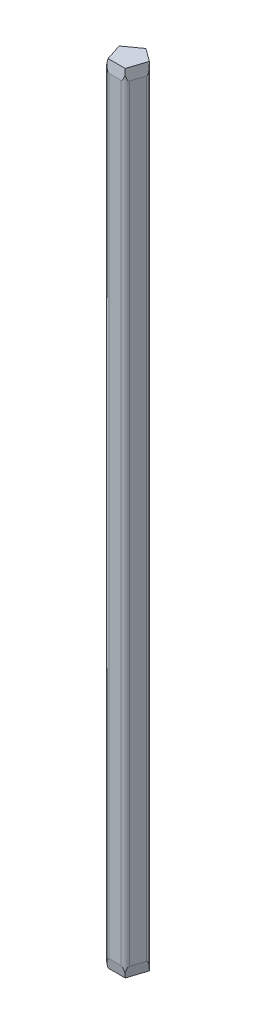
ISO-10303-21;
HEADER;
FILE_DESCRIPTION(('STEP AP214'),'2;1');
FILE_NAME('part.step','',(''),(''),'','','');
FILE_SCHEMA(('AUTOMOTIVE_DESIGN { 1 0 10303 214 1 1 1 1 }'));
ENDSEC;
DATA;
#1=APPLICATION_CONTEXT('core data for automotive mechanical design processes');
#2=APPLICATION_PROTOCOL_DEFINITION('international standard','automotive_design',2000,#1);
#3=PRODUCT_CONTEXT('',#1,'mechanical');
#4=PRODUCT('Part','Part','',(#3));
#5=PRODUCT_RELATED_PRODUCT_CATEGORY('part','',(#4));
#6=PRODUCT_DEFINITION_FORMATION('','',#4);
#7=PRODUCT_DEFINITION_CONTEXT('part definition',#1,'design');
#8=PRODUCT_DEFINITION('design','',#6,#7);
#9=PRODUCT_DEFINITION_SHAPE('','',#8);
#10=(LENGTH_UNIT() NAMED_UNIT(*) SI_UNIT(.MILLI.,.METRE.));
#11=(NAMED_UNIT(*) PLANE_ANGLE_UNIT() SI_UNIT($,.RADIAN.));
#12=(NAMED_UNIT(*) SI_UNIT($,.STERADIAN.) SOLID_ANGLE_UNIT());
#13=UNCERTAINTY_MEASURE_WITH_UNIT(LENGTH_MEASURE(1.E-05),#10,'distance_accuracy_value','');
#14=(GEOMETRIC_REPRESENTATION_CONTEXT(3) GLOBAL_UNCERTAINTY_ASSIGNED_CONTEXT((#13)) GLOBAL_UNIT_ASSIGNED_CONTEXT((#10,
#11,#12)) REPRESENTATION_CONTEXT('',''));
#15=CARTESIAN_POINT('',(0.,0.,0.));
#16=DIRECTION('',(0.,0.,1.));
#17=DIRECTION('',(1.,0.,0.));
#18=AXIS2_PLACEMENT_3D('',#15,#16,#17);
#19=CARTESIAN_POINT('',(6.12830373239022,300.,-1.99120658715122));
#20=DIRECTION('',(-0.587785252292472,0.,0.809016994374948));
#21=DIRECTION('',(0.809016994374948,0.,0.587785252292472));
#22=AXIS2_PLACEMENT_3D('',#19,#20,#21);
#23=PLANE('',#22);
#24=DIRECTION('',(-0.809016994374948,0.,-0.587785252292472));
#25=VECTOR('',#24,1.);
#26=CARTESIAN_POINT('',(6.12830373239022,300.,-1.99120658715122));
#27=LINE('',#26,#25);
#28=CARTESIAN_POINT('',(5.36418290441001,300.,-2.54637286521352));
#29=VERTEX_POINT('',#28);
#30=CARTESIAN_POINT('',(0.764120827980208,300.,-5.88851359520441));
#31=VERTEX_POINT('',#30);
#32=EDGE_CURVE('E396',#29,#31,#27,.T.);
#33=ORIENTED_EDGE('',*,*,#32,.F.);
#34=DIRECTION('',(0.,-1.,0.));
#35=VECTOR('',#34,1.);
#36=CARTESIAN_POINT('',(5.36418290441001,300.,-2.54637286521352));
#37=LINE('',#36,#35);
#38=CARTESIAN_POINT('',(5.36418290441001,0.,-2.54637286521352));
#39=VERTEX_POINT('',#38);
#40=EDGE_CURVE('E311',#29,#39,#37,.T.);
#41=ORIENTED_EDGE('',*,*,#40,.T.);
#42=DIRECTION('',(-0.809016994374948,0.,-0.587785252292472));
#43=VECTOR('',#42,1.);
#44=CARTESIAN_POINT('',(6.12830373239022,0.,-1.99120658715122));
#45=LINE('',#44,#43);
#46=CARTESIAN_POINT('',(0.764120827980208,0.,-5.88851359520441));
#47=VERTEX_POINT('',#46);
#48=EDGE_CURVE('E187',#39,#47,#45,.T.);
#49=ORIENTED_EDGE('',*,*,#48,.T.);
#50=DIRECTION('',(0.,-1.,0.));
#51=VECTOR('',#50,1.);
#52=CARTESIAN_POINT('',(0.76412082798021,300.,-5.88851359520441));
#53=LINE('',#52,#51);
#54=EDGE_CURVE('E308',#47,#31,#53,.F.);
#55=ORIENTED_EDGE('',*,*,#54,.T.);
#56=EDGE_LOOP('',(#33,#41,#49,#55));
#57=FACE_BOUND('',#56,.T.);
#58=ADVANCED_FACE('F49',(#57),#23,.F.);
#59=CARTESIAN_POINT('',(0.,300.,-6.4436798732667));
#60=DIRECTION('',(0.587785252292474,0.,0.809016994374947));
#61=DIRECTION('',(0.809016994374947,0.,-0.587785252292474));
#62=AXIS2_PLACEMENT_3D('',#59,#60,#61);
#63=PLANE('',#62);
#64=DIRECTION('',(0.809016994374947,0.,-0.587785252292474));
#65=VECTOR('',#64,1.);
#66=CARTESIAN_POINT('',(0.,296.,-6.4436798732667));
#67=LINE('',#66,#65);
#68=CARTESIAN_POINT('',(-5.01151175303453,296.,-2.80260345508841));
#69=VERTEX_POINT('',#68);
#70=CARTESIAN_POINT('',(-0.764120827980221,296.,-5.88851359520441));
#71=VERTEX_POINT('',#70);
#72=EDGE_CURVE('E231',#69,#71,#67,.T.);
#73=ORIENTED_EDGE('',*,*,#72,.T.);
#74=DIRECTION('',(0.,-1.,0.));
#75=VECTOR('',#74,1.);
#76=CARTESIAN_POINT('',(-0.764120827980221,300.,-5.88851359520441));
#77=LINE('',#76,#75);
#78=CARTESIAN_POINT('',(-0.764120827980221,4.00000000000011,-5.88851359520441));
#79=VERTEX_POINT('',#78);
#80=EDGE_CURVE('E336',#71,#79,#77,.T.);
#81=ORIENTED_EDGE('',*,*,#80,.T.);
#82=DIRECTION('',(-0.809016994374947,0.,0.587785252292474));
#83=VECTOR('',#82,1.);
#84=CARTESIAN_POINT('',(0.,4.00000000000011,-6.4436798732667));
#85=LINE('',#84,#83);
#86=CARTESIAN_POINT('',(-5.01151175303453,4.00000000000011,-2.80260345508841));
#87=VERTEX_POINT('',#86);
#88=EDGE_CURVE('E235',#79,#87,#85,.T.);
#89=ORIENTED_EDGE('',*,*,#88,.T.);
#90=DIRECTION('',(0.,-1.,0.));
#91=VECTOR('',#90,1.);
#92=CARTESIAN_POINT('',(-5.01151175303453,300.,-2.80260345508841));
#93=LINE('',#92,#91);
#94=EDGE_CURVE('E298',#87,#69,#93,.F.);
#95=ORIENTED_EDGE('',*,*,#94,.T.);
#96=EDGE_LOOP('',(#73,#81,#89,#95));
#97=FACE_BOUND('',#96,.T.);
#98=ADVANCED_FACE('F422',(#97),#63,.F.);
#99=CARTESIAN_POINT('',(-6.12830373239023,300.,-1.99120658715121));
#100=DIRECTION('',(0.951056516295153,0.,-0.309016994374948));
#101=DIRECTION('',(-0.309016994374948,0.,-0.951056516295153));
#102=AXIS2_PLACEMENT_3D('',#99,#100,#101);
#103=PLANE('',#102);
#104=DIRECTION('',(0.309016994374948,0.,0.951056516295153));
#105=VECTOR('',#104,1.);
#106=CARTESIAN_POINT('',(-6.12830373239023,4.00000000000011,-1.99120658715121));
#107=LINE('',#106,#105);
#108=CARTESIAN_POINT('',(-5.70172715463962,4.00000000000011,-0.678338876463612));
#109=VERTEX_POINT('',#108);
#110=CARTESIAN_POINT('',(-4.28143077423754,4.00000000000011,3.69288391140946));
#111=VERTEX_POINT('',#110);
#112=EDGE_CURVE('E228',#109,#111,#107,.T.);
#113=ORIENTED_EDGE('',*,*,#112,.T.);
#114=DIRECTION('',(0.,-1.,0.));
#115=VECTOR('',#114,1.);
#116=CARTESIAN_POINT('',(-4.28143077423754,300.,3.69288391140946));
#117=LINE('',#116,#115);
#118=CARTESIAN_POINT('',(-4.28143077423754,296.,3.69288391140946));
#119=VERTEX_POINT('',#118);
#120=EDGE_CURVE('E72',#111,#119,#117,.F.);
#121=ORIENTED_EDGE('',*,*,#120,.T.);
#122=DIRECTION('',(-0.309016994374948,0.,-0.951056516295153));
#123=VECTOR('',#122,1.);
#124=CARTESIAN_POINT('',(-6.12830373239023,296.,-1.99120658715121));
#125=LINE('',#124,#123);
#126=CARTESIAN_POINT('',(-5.70172715463962,296.,-0.678338876463612));
#127=VERTEX_POINT('',#126);
#128=EDGE_CURVE('E225',#119,#127,#125,.T.);
#129=ORIENTED_EDGE('',*,*,#128,.T.);
#130=DIRECTION('',(0.,-1.,0.));
#131=VECTOR('',#130,1.);
#132=CARTESIAN_POINT('',(-5.70172715463962,300.,-0.678338876463612));
#133=LINE('',#132,#131);
#134=EDGE_CURVE('E289',#127,#109,#133,.T.);
#135=ORIENTED_EDGE('',*,*,#134,.T.);
#136=EDGE_LOOP('',(#113,#121,#129,#135));
#137=FACE_BOUND('',#136,.T.);
#138=ADVANCED_FACE('F359',(#137),#103,.F.);
#139=CARTESIAN_POINT('',(-3.7875,300.,5.21304652378457));
#140=DIRECTION('',(0.,0.,-1.));
#141=DIRECTION('',(-1.,0.,0.));
#142=AXIS2_PLACEMENT_3D('',#139,#140,#141);
#143=PLANE('',#142);
#144=DIRECTION('',(-1.,0.,0.));
#145=VECTOR('',#144,1.);
#146=CARTESIAN_POINT('',(-3.7875,296.,5.21304652378457));
#147=LINE('',#146,#145);
#148=CARTESIAN_POINT('',(2.40706919678982,296.,5.21304652378457));
#149=VERTEX_POINT('',#148);
#150=CARTESIAN_POINT('',(-2.1891064383882,296.,5.21304652378457));
#151=VERTEX_POINT('',#150);
#152=EDGE_CURVE('E218',#149,#151,#147,.T.);
#153=ORIENTED_EDGE('',*,*,#152,.T.);
#154=DIRECTION('',(0.,-1.,0.));
#155=VECTOR('',#154,1.);
#156=CARTESIAN_POINT('',(-2.1891064383882,300.,5.21304652378457));
#157=LINE('',#156,#155);
#158=CARTESIAN_POINT('',(-2.1891064383882,4.00000000000011,5.21304652378457));
#159=VERTEX_POINT('',#158);
#160=EDGE_CURVE('E345',#151,#159,#157,.T.);
#161=ORIENTED_EDGE('',*,*,#160,.T.);
#162=DIRECTION('',(1.,0.,0.));
#163=VECTOR('',#162,1.);
#164=CARTESIAN_POINT('',(-3.7875,4.00000000000011,5.21304652378457));
#165=LINE('',#164,#163);
#166=CARTESIAN_POINT('',(2.40706919678982,4.00000000000011,5.21304652378457));
#167=VERTEX_POINT('',#166);
#168=EDGE_CURVE('E222',#159,#167,#165,.T.);
#169=ORIENTED_EDGE('',*,*,#168,.T.);
#170=DIRECTION('',(0.,-1.,0.));
#171=VECTOR('',#170,1.);
#172=CARTESIAN_POINT('',(2.40706919678982,300.,5.21304652378457));
#173=LINE('',#172,#171);
#174=EDGE_CURVE('E279',#167,#149,#173,.F.);
#175=ORIENTED_EDGE('',*,*,#174,.T.);
#176=EDGE_LOOP('',(#153,#161,#169,#175));
#177=FACE_BOUND('',#176,.T.);
#178=ADVANCED_FACE('F369',(#177),#143,.F.);
#179=CARTESIAN_POINT('',(3.78750000000001,300.,5.21304652378457));
#180=DIRECTION('',(-0.951056516295154,0.,-0.309016994374946));
#181=DIRECTION('',(-0.309016994374946,0.,0.951056516295154));
#182=AXIS2_PLACEMENT_3D('',#179,#180,#181);
#183=PLANE('',#182);
#184=DIRECTION('',(0.309016994374946,0.,-0.951056516295154));
#185=VECTOR('',#184,1.);
#186=CARTESIAN_POINT('',(3.78750000000001,4.00000000000011,5.21304652378457));
#187=LINE('',#186,#185);
#188=CARTESIAN_POINT('',(4.21407657775061,4.00000000000011,3.90017881309697));
#189=VERTEX_POINT('',#188);
#190=CARTESIAN_POINT('',(5.8364355476135,4.00000000000011,-1.09292867983866));
#191=VERTEX_POINT('',#190);
#192=EDGE_CURVE('E205',#189,#191,#187,.T.);
#193=ORIENTED_EDGE('',*,*,#192,.T.);
#194=DIRECTION('',(0.,-1.,0.));
#195=VECTOR('',#194,1.);
#196=CARTESIAN_POINT('',(5.83643554761349,300.,-1.09292867983865));
#197=LINE('',#196,#195);
#198=CARTESIAN_POINT('',(5.8364355476135,296.,-1.09292867983866));
#199=VERTEX_POINT('',#198);
#200=EDGE_CURVE('E324',#191,#199,#197,.F.);
#201=ORIENTED_EDGE('',*,*,#200,.T.);
#202=DIRECTION('',(-0.309016994374946,0.,0.951056516295154));
#203=VECTOR('',#202,1.);
#204=CARTESIAN_POINT('',(3.78750000000001,296.,5.21304652378457));
#205=LINE('',#204,#203);
#206=CARTESIAN_POINT('',(4.21407657775061,296.,3.90017881309697));
#207=VERTEX_POINT('',#206);
#208=EDGE_CURVE('E209',#199,#207,#205,.T.);
#209=ORIENTED_EDGE('',*,*,#208,.T.);
#210=DIRECTION('',(0.,-1.,0.));
#211=VECTOR('',#210,1.);
#212=CARTESIAN_POINT('',(4.21407657775061,300.,3.90017881309697));
#213=LINE('',#212,#211);
#214=EDGE_CURVE('E251',#207,#189,#213,.T.);
#215=ORIENTED_EDGE('',*,*,#214,.T.);
#216=EDGE_LOOP('',(#193,#201,#209,#215));
#217=FACE_BOUND('',#216,.T.);
#218=ADVANCED_FACE('F404',(#217),#183,.F.);
#219=CARTESIAN_POINT('',(0.,300.,0.));
#220=DIRECTION('',(0.,1.,0.));
#221=DIRECTION('',(0.,0.,1.));
#222=AXIS2_PLACEMENT_3D('',#219,#220,#221);
#223=PLANE('',#222);
#224=DIRECTION('',(0.309016994374946,0.,-0.951056516295154));
#225=VECTOR('',#224,1.);
#226=CARTESIAN_POINT('',(5.45751603638448,300.,-2.20915872157418));
#227=LINE('',#226,#225);
#228=CARTESIAN_POINT('',(3.27506379872208,300.,4.50773860095071));
#229=VERTEX_POINT('',#228);
#230=CARTESIAN_POINT('',(5.52287220994946,300.,-2.41030434100787));
#231=VERTEX_POINT('',#230);
#232=EDGE_CURVE('E247',#229,#231,#227,.T.);
#233=ORIENTED_EDGE('',*,*,#232,.T.);
#234=CARTESIAN_POINT('',(4.60006207642979,300.,-1.49465077252609));
#235=DIRECTION('',(0.,1.,0.));
#236=DIRECTION('',(0.,0.,1.));
#237=AXIS2_PLACEMENT_3D('',#234,#235,#236);
#238=CIRCLE('',#237,1.3);
#239=EDGE_CURVE('E333',#231,#29,#238,.T.);
#240=ORIENTED_EDGE('',*,*,#239,.T.);
#241=ORIENTED_EDGE('',*,*,#32,.T.);
#242=CARTESIAN_POINT('',(0.,300.,-4.83679150251697));
#243=DIRECTION('',(0.,1.,0.));
#244=DIRECTION('',(0.,0.,1.));
#245=AXIS2_PLACEMENT_3D('',#242,#243,#244);
#246=CIRCLE('',#245,1.3);
#247=CARTESIAN_POINT('',(0.585674279134514,300.,-5.99738860692499));
#248=VERTEX_POINT('',#247);
#249=EDGE_CURVE('E330',#31,#248,#246,.T.);
#250=ORIENTED_EDGE('',*,*,#249,.T.);
#251=DIRECTION('',(-0.809016994374947,0.,0.587785252292474));
#252=VECTOR('',#251,1.);
#253=CARTESIAN_POINT('',(-5.71373413702345,300.,-1.42060049131133));
#254=LINE('',#253,#252);
#255=CARTESIAN_POINT('',(-5.29916454165667,300.,-1.72180293316327));
#256=VERTEX_POINT('',#255);
#257=EDGE_CURVE('E238',#248,#256,#254,.T.);
#258=ORIENTED_EDGE('',*,*,#257,.T.);
#259=DIRECTION('',(0.309016994374948,0.,0.951056516295153));
#260=VECTOR('',#259,1.);
#261=CARTESIAN_POINT('',(-3.11671230399425,300.,4.99509438936162));
#262=LINE('',#261,#260);
#263=CARTESIAN_POINT('',(-3.27506379872207,300.,4.50773860095071));
#264=VERTEX_POINT('',#263);
#265=EDGE_CURVE('E241',#256,#264,#262,.T.);
#266=ORIENTED_EDGE('',*,*,#265,.T.);
#267=DIRECTION('',(1.,0.,0.));
#268=VECTOR('',#267,1.);
#269=CARTESIAN_POINT('',(3.7875,300.,4.50773860095071));
#270=LINE('',#269,#268);
#271=EDGE_CURVE('E244',#264,#229,#270,.T.);
#272=ORIENTED_EDGE('',*,*,#271,.T.);
#273=EDGE_LOOP('',(#233,#240,#241,#250,#258,#266,#272));
#274=FACE_BOUND('',#273,.T.);
#275=ADVANCED_FACE('F385',(#274),#223,.T.);
#276=CARTESIAN_POINT('',(0.,0.,0.));
#277=DIRECTION('',(0.,1.,0.));
#278=DIRECTION('',(0.,0.,1.));
#279=AXIS2_PLACEMENT_3D('',#276,#277,#278);
#280=PLANE('',#279);
#281=ORIENTED_EDGE('',*,*,#48,.F.);
#282=CARTESIAN_POINT('',(4.60006207642979,0.,-1.49465077252609));
#283=DIRECTION('',(0.,1.,0.));
#284=DIRECTION('',(0.,0.,1.));
#285=AXIS2_PLACEMENT_3D('',#282,#283,#284);
#286=CIRCLE('',#285,1.3);
#287=CARTESIAN_POINT('',(5.52287220994946,0.,-2.41030434100787));
#288=VERTEX_POINT('',#287);
#289=EDGE_CURVE('E318',#39,#288,#286,.F.);
#290=ORIENTED_EDGE('',*,*,#289,.T.);
#291=DIRECTION('',(-0.309016994374946,0.,0.951056516295154));
#292=VECTOR('',#291,1.);
#293=CARTESIAN_POINT('',(4.28711417018937,0.,1.39296783389371));
#294=LINE('',#293,#292);
#295=CARTESIAN_POINT('',(3.27506379872208,0.,4.50773860095071));
#296=VERTEX_POINT('',#295);
#297=EDGE_CURVE('E215',#288,#296,#294,.T.);
#298=ORIENTED_EDGE('',*,*,#297,.T.);
#299=DIRECTION('',(-1.,0.,0.));
#300=VECTOR('',#299,1.);
#301=CARTESIAN_POINT('',(0.,0.,4.50773860095071));
#302=LINE('',#301,#300);
#303=CARTESIAN_POINT('',(-3.27506379872207,0.,4.50773860095071));
#304=VERTEX_POINT('',#303);
#305=EDGE_CURVE('E198',#296,#304,#302,.T.);
#306=ORIENTED_EDGE('',*,*,#305,.T.);
#307=DIRECTION('',(-0.309016994374948,0.,-0.951056516295153));
#308=VECTOR('',#307,1.);
#309=CARTESIAN_POINT('',(-4.28711417018937,0.,1.39296783389372));
#310=LINE('',#309,#308);
#311=CARTESIAN_POINT('',(-5.29916454165667,0.,-1.72180293316327));
#312=VERTEX_POINT('',#311);
#313=EDGE_CURVE('E179',#304,#312,#310,.T.);
#314=ORIENTED_EDGE('',*,*,#313,.T.);
#315=DIRECTION('',(0.809016994374947,0.,-0.587785252292474));
#316=VECTOR('',#315,1.);
#317=CARTESIAN_POINT('',(-2.64958227082834,0.,-3.64683713436907));
#318=LINE('',#317,#316);
#319=CARTESIAN_POINT('',(0.585674279134514,0.,-5.99738860692499));
#320=VERTEX_POINT('',#319);
#321=EDGE_CURVE('E195',#312,#320,#318,.T.);
#322=ORIENTED_EDGE('',*,*,#321,.T.);
#323=CARTESIAN_POINT('',(0.,0.,-4.83679150251697));
#324=DIRECTION('',(0.,1.,0.));
#325=DIRECTION('',(0.,0.,1.));
#326=AXIS2_PLACEMENT_3D('',#323,#324,#325);
#327=CIRCLE('',#326,1.3);
#328=EDGE_CURVE('E315',#320,#47,#327,.F.);
#329=ORIENTED_EDGE('',*,*,#328,.T.);
#330=EDGE_LOOP('',(#281,#290,#298,#306,#314,#322,#329));
#331=FACE_BOUND('',#330,.T.);
#332=ADVANCED_FACE('F194',(#331),#280,.F.);
#333=CARTESIAN_POINT('',(0.,4.00000000000011,-6.4436798732667));
#334=DIRECTION('',(0.578855473563866,0.173648177666925,0.796726208379082));
#335=DIRECTION('',(-0.809016994374947,0.,0.587785252292474));
#336=AXIS2_PLACEMENT_3D('',#333,#334,#335);
#337=PLANE('',#336);
#338=ORIENTED_EDGE('',*,*,#88,.F.);
#339=CARTESIAN_POINT('',(0.,-3.3726663655031,-4.83679150251697));
#340=DIRECTION('',(0.578855473563866,0.173648177666925,0.796726208379082));
#341=DIRECTION('',(0.102067837920082,-0.984807753012209,0.140484326774783));
#342=AXIS2_PLACEMENT_3D('',#339,#340,#341);
#343=ELLIPSE('',#342,7.48640162808694,1.3);
#344=EDGE_CURVE('E203',#79,#320,#343,.F.);
#345=ORIENTED_EDGE('',*,*,#344,.T.);
#346=ORIENTED_EDGE('',*,*,#321,.F.);
#347=DIRECTION('',(-0.202530197739811,0.977062476376896,-0.0658060503276096));
#348=VECTOR('',#347,1.);
#349=CARTESIAN_POINT('',(-5.93627130556293,3.07358171475464,-1.92881146935962));
#350=LINE('',#349,#348);
#351=CARTESIAN_POINT('',(-5.70172715464024,1.94207494945413,-1.85260345508861));
#352=VERTEX_POINT('',#351);
#353=EDGE_CURVE('E175',#352,#312,#350,.F.);
#354=ORIENTED_EDGE('',*,*,#353,.F.);
#355=CARTESIAN_POINT('',(-3.89471977367883,-6.77543545727383,-1.26547116577601));
#356=DIRECTION('',(0.578855473563866,0.173648177666925,0.796726208379082));
#357=DIRECTION('',(0.102067837920082,-0.984807753012209,0.140484326774783));
#358=AXIS2_PLACEMENT_3D('',#355,#356,#357);
#359=ELLIPSE('',#358,10.9416639179732,1.9);
#360=EDGE_CURVE('E295',#352,#87,#359,.F.);
#361=ORIENTED_EDGE('',*,*,#360,.T.);
#362=EDGE_LOOP('',(#338,#345,#346,#354,#361));
#363=FACE_BOUND('',#362,.T.);
#364=ADVANCED_FACE('F202',(#363),#337,.F.);
#365=CARTESIAN_POINT('',(-6.12830373239023,4.00000000000011,-1.99120658715121));
#366=DIRECTION('',(0.936607830800249,0.173648177666925,-0.304322331872979));
#367=DIRECTION('',(0.309016994374948,0.,0.951056516295153));
#368=AXIS2_PLACEMENT_3D('',#365,#366,#367);
#369=PLANE('',#368);
#370=DIRECTION('',(-0.12517054595144,0.977062476376896,0.172282476423069));
#371=VECTOR('',#370,1.);
#372=CARTESIAN_POINT('',(-3.6688174332786,3.07358171475464,5.04969398467413));
#373=LINE('',#372,#371);
#374=CARTESIAN_POINT('',(-3.4822339934317,1.61713941515444,4.79288391140954));
#375=VERTEX_POINT('',#374);
#376=EDGE_CURVE('E188',#375,#304,#373,.F.);
#377=ORIENTED_EDGE('',*,*,#376,.F.);
#378=CARTESIAN_POINT('',(-2.1891064383882,-8.47682000315919,3.01304652378457));
#379=DIRECTION('',(0.936607830800249,0.173648177666925,-0.304322331872979));
#380=DIRECTION('',(0.165149230912908,-0.984807753012209,-0.0536602379413203));
#381=AXIS2_PLACEMENT_3D('',#378,#379,#380);
#382=ELLIPSE('',#381,12.6692950629164,2.2);
#383=EDGE_CURVE('E352',#375,#111,#382,.F.);
#384=ORIENTED_EDGE('',*,*,#383,.T.);
#385=ORIENTED_EDGE('',*,*,#112,.F.);
#386=CARTESIAN_POINT('',(-3.89471977367883,-6.77543545727388,-1.26547116577601));
#387=DIRECTION('',(0.936607830800249,0.173648177666925,-0.304322331872979));
#388=DIRECTION('',(0.165149230912908,-0.984807753012209,-0.0536602379413203));
#389=AXIS2_PLACEMENT_3D('',#386,#387,#388);
#390=ELLIPSE('',#389,10.9416639179732,1.9);
#391=EDGE_CURVE('E181',#109,#352,#390,.F.);
#392=ORIENTED_EDGE('',*,*,#391,.T.);
#393=ORIENTED_EDGE('',*,*,#353,.T.);
#394=ORIENTED_EDGE('',*,*,#313,.F.);
#395=EDGE_LOOP('',(#377,#384,#385,#392,#393,#394));
#396=FACE_BOUND('',#395,.T.);
#397=ADVANCED_FACE('F178',(#396),#369,.F.);
#398=CARTESIAN_POINT('',(-3.7875,4.00000000000011,5.21304652378457));
#399=DIRECTION('',(0.,0.173648177666925,-0.984807753012209));
#400=DIRECTION('',(1.,0.,0.));
#401=AXIS2_PLACEMENT_3D('',#398,#399,#400);
#402=PLANE('',#401);
#403=ORIENTED_EDGE('',*,*,#168,.F.);
#404=CARTESIAN_POINT('',(-2.1891064383882,-8.47682000315919,3.01304652378457));
#405=DIRECTION('',(0.,0.173648177666925,-0.984807753012209));
#406=DIRECTION('',(0.,-0.984807753012209,-0.173648177666925));
#407=AXIS2_PLACEMENT_3D('',#404,#405,#406);
#408=ELLIPSE('',#407,12.6692950629163,2.2);
#409=EDGE_CURVE('E349',#159,#375,#408,.F.);
#410=ORIENTED_EDGE('',*,*,#409,.T.);
#411=ORIENTED_EDGE('',*,*,#376,.T.);
#412=ORIENTED_EDGE('',*,*,#305,.F.);
#413=DIRECTION('',(0.125170545951441,0.977062476376896,0.172282476423069));
#414=VECTOR('',#413,1.);
#415=CARTESIAN_POINT('',(3.66881743327861,3.07358171475464,5.04969398467412));
#416=LINE('',#415,#414);
#417=CARTESIAN_POINT('',(3.52386117614559,1.94207494945175,4.85017881309707));
#418=VERTEX_POINT('',#417);
#419=EDGE_CURVE('E252',#418,#296,#416,.F.);
#420=ORIENTED_EDGE('',*,*,#419,.F.);
#421=CARTESIAN_POINT('',(2.40706919678982,-6.77543545727383,3.31304652378457));
#422=DIRECTION('',(0.,0.173648177666925,-0.984807753012209));
#423=DIRECTION('',(0.,-0.984807753012209,-0.173648177666925));
#424=AXIS2_PLACEMENT_3D('',#421,#422,#423);
#425=ELLIPSE('',#424,10.9416639179732,1.9);
#426=EDGE_CURVE('E275',#418,#167,#425,.F.);
#427=ORIENTED_EDGE('',*,*,#426,.T.);
#428=EDGE_LOOP('',(#403,#410,#411,#412,#420,#427));
#429=FACE_BOUND('',#428,.T.);
#430=ADVANCED_FACE('F410',(#429),#402,.F.);
#431=CARTESIAN_POINT('',(3.78750000000001,4.00000000000011,5.21304652378457));
#432=DIRECTION('',(-0.93660783080025,0.173648177666926,-0.304322331872977));
#433=DIRECTION('',(0.309016994374946,0.,-0.951056516295154));
#434=AXIS2_PLACEMENT_3D('',#431,#432,#433);
#435=PLANE('',#434);
#436=ORIENTED_EDGE('',*,*,#297,.F.);
#437=CARTESIAN_POINT('',(4.60006207642979,-3.37266636550315,-1.49465077252609));
#438=DIRECTION('',(-0.93660783080025,0.173648177666926,-0.304322331872977));
#439=DIRECTION('',(-0.165149230912908,-0.984807753012209,-0.05366023794132));
#440=AXIS2_PLACEMENT_3D('',#437,#438,#439);
#441=ELLIPSE('',#440,7.48640162808693,1.3);
#442=EDGE_CURVE('E321',#288,#191,#441,.F.);
#443=ORIENTED_EDGE('',*,*,#442,.T.);
#444=ORIENTED_EDGE('',*,*,#192,.F.);
#445=CARTESIAN_POINT('',(2.40706919678982,-6.77543545727388,3.31304652378457));
#446=DIRECTION('',(-0.93660783080025,0.173648177666926,-0.304322331872977));
#447=DIRECTION('',(-0.165149230912908,-0.984807753012209,-0.05366023794132));
#448=AXIS2_PLACEMENT_3D('',#445,#446,#447);
#449=ELLIPSE('',#448,10.9416639179732,1.9);
#450=EDGE_CURVE('E272',#189,#418,#449,.F.);
#451=ORIENTED_EDGE('',*,*,#450,.T.);
#452=ORIENTED_EDGE('',*,*,#419,.T.);
#453=EDGE_LOOP('',(#436,#443,#444,#451,#452));
#454=FACE_BOUND('',#453,.T.);
#455=ADVANCED_FACE('F407',(#454),#435,.F.);
#456=CARTESIAN_POINT('',(-2.64958227082834,300.,-3.64683713436907));
#457=DIRECTION('',(-0.578855473563866,0.173648177666925,-0.796726208379082));
#458=DIRECTION('',(0.809016994374947,0.,-0.587785252292474));
#459=AXIS2_PLACEMENT_3D('',#456,#457,#458);
#460=PLANE('',#459);
#461=ORIENTED_EDGE('',*,*,#257,.F.);
#462=CARTESIAN_POINT('',(0.,303.372666365503,-4.83679150251697));
#463=DIRECTION('',(-0.578855473563866,0.173648177666925,-0.796726208379082));
#464=DIRECTION('',(-0.102067837920082,-0.984807753012209,-0.140484326774783));
#465=AXIS2_PLACEMENT_3D('',#462,#463,#464);
#466=ELLIPSE('',#465,7.48640162808694,1.3);
#467=EDGE_CURVE('E342',#248,#71,#466,.T.);
#468=ORIENTED_EDGE('',*,*,#467,.T.);
#469=ORIENTED_EDGE('',*,*,#72,.F.);
#470=CARTESIAN_POINT('',(-3.89471977367883,306.775435457274,-1.26547116577601));
#471=DIRECTION('',(-0.578855473563866,0.173648177666925,-0.796726208379082));
#472=DIRECTION('',(-0.102067837920082,-0.984807753012209,-0.140484326774783));
#473=AXIS2_PLACEMENT_3D('',#470,#471,#472);
#474=ELLIPSE('',#473,10.9416639179732,1.9);
#475=CARTESIAN_POINT('',(-5.70172715463962,298.057925050549,-1.85260345508841));
#476=VERTEX_POINT('',#475);
#477=EDGE_CURVE('E301',#69,#476,#474,.T.);
#478=ORIENTED_EDGE('',*,*,#477,.T.);
#479=DIRECTION('',(0.202530197739811,0.977062476376896,0.0658060503276096));
#480=VECTOR('',#479,1.);
#481=CARTESIAN_POINT('',(-5.21613900379755,300.400538480328,-1.69482630062251));
#482=LINE('',#481,#480);
#483=EDGE_CURVE('E256',#256,#476,#482,.F.);
#484=ORIENTED_EDGE('',*,*,#483,.F.);
#485=EDGE_LOOP('',(#461,#468,#469,#478,#484));
#486=FACE_BOUND('',#485,.T.);
#487=ADVANCED_FACE('F417',(#486),#460,.T.);
#488=CARTESIAN_POINT('',(-4.28711417018937,300.,1.39296783389372));
#489=DIRECTION('',(-0.936607830800249,0.173648177666925,0.304322331872979));
#490=DIRECTION('',(-0.309016994374948,0.,-0.951056516295153));
#491=AXIS2_PLACEMENT_3D('',#488,#489,#490);
#492=PLANE('',#491);
#493=ORIENTED_EDGE('',*,*,#128,.F.);
#494=CARTESIAN_POINT('',(-2.1891064383882,308.476820003159,3.01304652378457));
#495=DIRECTION('',(-0.936607830800249,0.173648177666925,0.304322331872979));
#496=DIRECTION('',(-0.165149230912908,-0.984807753012209,0.0536602379413203));
#497=AXIS2_PLACEMENT_3D('',#494,#495,#496);
#498=ELLIPSE('',#497,12.6692950629164,2.2);
#499=CARTESIAN_POINT('',(-3.48223399343164,298.382860584846,4.79288391140946));
#500=VERTEX_POINT('',#499);
#501=EDGE_CURVE('E58',#119,#500,#498,.T.);
#502=ORIENTED_EDGE('',*,*,#501,.T.);
#503=DIRECTION('',(0.12517054595144,0.977062476376896,-0.172282476423069));
#504=VECTOR('',#503,1.);
#505=CARTESIAN_POINT('',(-3.2237511943909,300.400538480328,4.43711286005699));
#506=LINE('',#505,#504);
#507=EDGE_CURVE('E263',#264,#500,#506,.F.);
#508=ORIENTED_EDGE('',*,*,#507,.F.);
#509=ORIENTED_EDGE('',*,*,#265,.F.);
#510=ORIENTED_EDGE('',*,*,#483,.T.);
#511=CARTESIAN_POINT('',(-3.89471977367883,306.775435457274,-1.26547116577601));
#512=DIRECTION('',(-0.936607830800249,0.173648177666925,0.304322331872979));
#513=DIRECTION('',(-0.165149230912908,-0.984807753012209,0.0536602379413203));
#514=AXIS2_PLACEMENT_3D('',#511,#512,#513);
#515=ELLIPSE('',#514,10.9416639179732,1.9);
#516=EDGE_CURVE('E304',#476,#127,#515,.T.);
#517=ORIENTED_EDGE('',*,*,#516,.T.);
#518=EDGE_LOOP('',(#493,#502,#508,#509,#510,#517));
#519=FACE_BOUND('',#518,.T.);
#520=ADVANCED_FACE('F446',(#519),#492,.T.);
#521=CARTESIAN_POINT('',(0.,300.,4.50773860095071));
#522=DIRECTION('',(0.,0.173648177666925,0.984807753012209));
#523=DIRECTION('',(-1.,0.,0.));
#524=AXIS2_PLACEMENT_3D('',#521,#522,#523);
#525=PLANE('',#524);
#526=ORIENTED_EDGE('',*,*,#507,.T.);
#527=CARTESIAN_POINT('',(-2.1891064383882,308.476820003159,3.01304652378457));
#528=DIRECTION('',(0.,0.173648177666925,0.984807753012209));
#529=DIRECTION('',(0.,-0.984807753012209,0.173648177666925));
#530=AXIS2_PLACEMENT_3D('',#527,#528,#529);
#531=ELLIPSE('',#530,12.6692950629163,2.2);
#532=EDGE_CURVE('E11',#500,#151,#531,.T.);
#533=ORIENTED_EDGE('',*,*,#532,.T.);
#534=ORIENTED_EDGE('',*,*,#152,.F.);
#535=CARTESIAN_POINT('',(2.40706919678982,306.775435457274,3.31304652378457));
#536=DIRECTION('',(0.,0.173648177666925,0.984807753012209));
#537=DIRECTION('',(0.,-0.984807753012209,0.173648177666925));
#538=AXIS2_PLACEMENT_3D('',#535,#536,#537);
#539=ELLIPSE('',#538,10.9416639179732,1.9);
#540=CARTESIAN_POINT('',(3.52386117614552,298.057925050549,4.85017881309697));
#541=VERTEX_POINT('',#540);
#542=EDGE_CURVE('E282',#149,#541,#539,.T.);
#543=ORIENTED_EDGE('',*,*,#542,.T.);
#544=DIRECTION('',(-0.125170545951441,0.977062476376896,-0.172282476423069));
#545=VECTOR('',#544,1.);
#546=CARTESIAN_POINT('',(3.22375119439091,300.400538480328,4.43711286005698));
#547=LINE('',#546,#545);
#548=EDGE_CURVE('E259',#229,#541,#547,.F.);
#549=ORIENTED_EDGE('',*,*,#548,.F.);
#550=ORIENTED_EDGE('',*,*,#271,.F.);
#551=EDGE_LOOP('',(#526,#533,#534,#543,#549,#550));
#552=FACE_BOUND('',#551,.T.);
#553=ADVANCED_FACE('F365',(#552),#525,.T.);
#554=CARTESIAN_POINT('',(4.28711417018937,300.,1.39296783389371));
#555=DIRECTION('',(0.93660783080025,0.173648177666926,0.304322331872977));
#556=DIRECTION('',(-0.309016994374946,0.,0.951056516295154));
#557=AXIS2_PLACEMENT_3D('',#554,#555,#556);
#558=PLANE('',#557);
#559=ORIENTED_EDGE('',*,*,#208,.F.);
#560=CARTESIAN_POINT('',(4.60006207642979,303.372666365503,-1.49465077252609));
#561=DIRECTION('',(0.93660783080025,0.173648177666926,0.304322331872977));
#562=DIRECTION('',(0.165149230912908,-0.984807753012209,0.05366023794132));
#563=AXIS2_PLACEMENT_3D('',#560,#561,#562);
#564=ELLIPSE('',#563,7.48640162808693,1.3);
#565=EDGE_CURVE('E327',#199,#231,#564,.T.);
#566=ORIENTED_EDGE('',*,*,#565,.T.);
#567=ORIENTED_EDGE('',*,*,#232,.F.);
#568=ORIENTED_EDGE('',*,*,#548,.T.);
#569=CARTESIAN_POINT('',(2.40706919678982,306.775435457274,3.31304652378457));
#570=DIRECTION('',(0.93660783080025,0.173648177666926,0.304322331872977));
#571=DIRECTION('',(0.165149230912908,-0.984807753012209,0.05366023794132));
#572=AXIS2_PLACEMENT_3D('',#569,#570,#571);
#573=ELLIPSE('',#572,10.9416639179732,1.9);
#574=EDGE_CURVE('E285',#541,#207,#573,.T.);
#575=ORIENTED_EDGE('',*,*,#574,.T.);
#576=EDGE_LOOP('',(#559,#566,#567,#568,#575));
#577=FACE_BOUND('',#576,.T.);
#578=ADVANCED_FACE('F381',(#577),#558,.T.);
#579=CARTESIAN_POINT('',(2.40706919678982,300.,3.31304652378457));
#580=DIRECTION('',(0.,-1.,0.));
#581=DIRECTION('',(0.,0.,-1.));
#582=AXIS2_PLACEMENT_3D('',#579,#580,#581);
#583=CYLINDRICAL_SURFACE('',#582,1.9);
#584=ORIENTED_EDGE('',*,*,#542,.F.);
#585=ORIENTED_EDGE('',*,*,#174,.F.);
#586=ORIENTED_EDGE('',*,*,#426,.F.);
#587=ORIENTED_EDGE('',*,*,#450,.F.);
#588=ORIENTED_EDGE('',*,*,#214,.F.);
#589=ORIENTED_EDGE('',*,*,#574,.F.);
#590=EDGE_LOOP('',(#584,#585,#586,#587,#588,#589));
#591=FACE_BOUND('',#590,.T.);
#592=ADVANCED_FACE('F374',(#591),#583,.T.);
#593=CARTESIAN_POINT('',(-3.89471977367883,300.,-1.26547116577601));
#594=DIRECTION('',(0.,-1.,0.));
#595=DIRECTION('',(0.,0.,-1.));
#596=AXIS2_PLACEMENT_3D('',#593,#594,#595);
#597=CYLINDRICAL_SURFACE('',#596,1.9);
#598=ORIENTED_EDGE('',*,*,#477,.F.);
#599=ORIENTED_EDGE('',*,*,#94,.F.);
#600=ORIENTED_EDGE('',*,*,#360,.F.);
#601=ORIENTED_EDGE('',*,*,#391,.F.);
#602=ORIENTED_EDGE('',*,*,#134,.F.);
#603=ORIENTED_EDGE('',*,*,#516,.F.);
#604=EDGE_LOOP('',(#598,#599,#600,#601,#602,#603));
#605=FACE_BOUND('',#604,.T.);
#606=ADVANCED_FACE('F554',(#605),#597,.T.);
#607=CARTESIAN_POINT('',(4.60006207642979,300.,-1.49465077252609));
#608=DIRECTION('',(0.,-1.,0.));
#609=DIRECTION('',(0.,0.,-1.));
#610=AXIS2_PLACEMENT_3D('',#607,#608,#609);
#611=CYLINDRICAL_SURFACE('',#610,1.3);
#612=ORIENTED_EDGE('',*,*,#565,.F.);
#613=ORIENTED_EDGE('',*,*,#200,.F.);
#614=ORIENTED_EDGE('',*,*,#442,.F.);
#615=ORIENTED_EDGE('',*,*,#289,.F.);
#616=ORIENTED_EDGE('',*,*,#40,.F.);
#617=ORIENTED_EDGE('',*,*,#239,.F.);
#618=EDGE_LOOP('',(#612,#613,#614,#615,#616,#617));
#619=FACE_BOUND('',#618,.T.);
#620=ADVANCED_FACE('F390',(#619),#611,.T.);
#621=CARTESIAN_POINT('',(0.,300.,-4.83679150251697));
#622=DIRECTION('',(0.,-1.,0.));
#623=DIRECTION('',(0.,0.,-1.));
#624=AXIS2_PLACEMENT_3D('',#621,#622,#623);
#625=CYLINDRICAL_SURFACE('',#624,1.3);
#626=ORIENTED_EDGE('',*,*,#249,.F.);
#627=ORIENTED_EDGE('',*,*,#54,.F.);
#628=ORIENTED_EDGE('',*,*,#328,.F.);
#629=ORIENTED_EDGE('',*,*,#344,.F.);
#630=ORIENTED_EDGE('',*,*,#80,.F.);
#631=ORIENTED_EDGE('',*,*,#467,.F.);
#632=EDGE_LOOP('',(#626,#627,#628,#629,#630,#631));
#633=FACE_BOUND('',#632,.T.);
#634=ADVANCED_FACE('F571',(#633),#625,.T.);
#635=CARTESIAN_POINT('',(-2.1891064383882,300.,3.01304652378457));
#636=DIRECTION('',(0.,-1.,0.));
#637=DIRECTION('',(0.,0.,-1.));
#638=AXIS2_PLACEMENT_3D('',#635,#636,#637);
#639=CYLINDRICAL_SURFACE('',#638,2.2);
#640=ORIENTED_EDGE('',*,*,#501,.F.);
#641=ORIENTED_EDGE('',*,*,#120,.F.);
#642=ORIENTED_EDGE('',*,*,#383,.F.);
#643=ORIENTED_EDGE('',*,*,#409,.F.);
#644=ORIENTED_EDGE('',*,*,#160,.F.);
#645=ORIENTED_EDGE('',*,*,#532,.F.);
#646=EDGE_LOOP('',(#640,#641,#642,#643,#644,#645));
#647=FACE_BOUND('',#646,.T.);
#648=ADVANCED_FACE('F51',(#647),#639,.T.);
#649=CLOSED_SHELL('',(#58,#98,#138,#178,#218,#275,#332,#364,#397,#430,#455,#487,#520,#553,#578,
#592,#606,#620,#634,#648));
#650=MANIFOLD_SOLID_BREP('B2',#649);
#651=ADVANCED_BREP_SHAPE_REPRESENTATION('',(#18,#650),#14);
#652=SHAPE_DEFINITION_REPRESENTATION(#9,#651);
ENDSEC;
END-ISO-10303-21;
